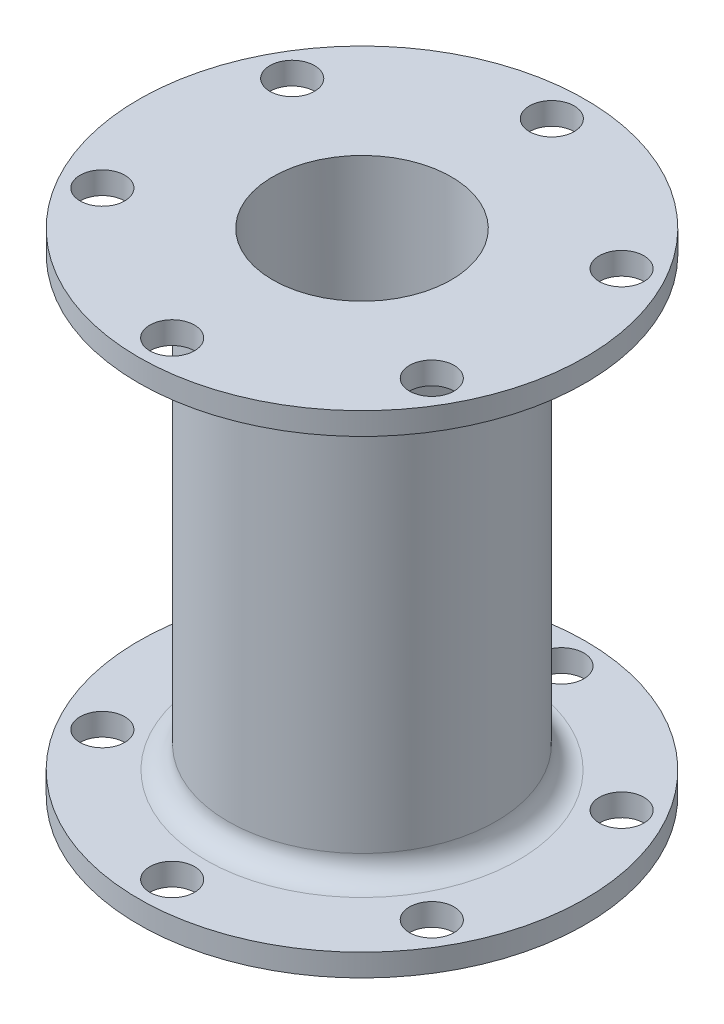
ISO-10303-21;
HEADER;
FILE_DESCRIPTION(('STEP AP214'),'2;1');
FILE_NAME('part.step','',(''),(''),'','','');
FILE_SCHEMA(('AUTOMOTIVE_DESIGN { 1 0 10303 214 1 1 1 1 }'));
ENDSEC;
DATA;
#1=APPLICATION_CONTEXT('core data for automotive mechanical design processes');
#2=APPLICATION_PROTOCOL_DEFINITION('international standard','automotive_design',2000,#1);
#3=PRODUCT_CONTEXT('',#1,'mechanical');
#4=PRODUCT('Part','Part','',(#3));
#5=PRODUCT_RELATED_PRODUCT_CATEGORY('part','',(#4));
#6=PRODUCT_DEFINITION_FORMATION('','',#4);
#7=PRODUCT_DEFINITION_CONTEXT('part definition',#1,'design');
#8=PRODUCT_DEFINITION('design','',#6,#7);
#9=PRODUCT_DEFINITION_SHAPE('','',#8);
#10=(LENGTH_UNIT() NAMED_UNIT(*) SI_UNIT(.MILLI.,.METRE.));
#11=(NAMED_UNIT(*) PLANE_ANGLE_UNIT() SI_UNIT($,.RADIAN.));
#12=(NAMED_UNIT(*) SI_UNIT($,.STERADIAN.) SOLID_ANGLE_UNIT());
#13=UNCERTAINTY_MEASURE_WITH_UNIT(LENGTH_MEASURE(1.E-05),#10,'distance_accuracy_value','');
#14=(GEOMETRIC_REPRESENTATION_CONTEXT(3) GLOBAL_UNCERTAINTY_ASSIGNED_CONTEXT((#13)) GLOBAL_UNIT_ASSIGNED_CONTEXT((#10,
#11,#12)) REPRESENTATION_CONTEXT('',''));
#15=CARTESIAN_POINT('',(0.,0.,0.));
#16=DIRECTION('',(0.,0.,1.));
#17=DIRECTION('',(1.,0.,0.));
#18=AXIS2_PLACEMENT_3D('',#15,#16,#17);
#19=CARTESIAN_POINT('',(0.,12.7,0.));
#20=DIRECTION('',(0.,-1.,0.));
#21=DIRECTION('',(0.,0.,-1.));
#22=AXIS2_PLACEMENT_3D('',#19,#20,#21);
#23=CYLINDRICAL_SURFACE('',#22,127.);
#24=CARTESIAN_POINT('',(0.,12.7,0.));
#25=DIRECTION('',(0.,1.,0.));
#26=DIRECTION('',(0.,0.,1.));
#27=AXIS2_PLACEMENT_3D('',#24,#25,#26);
#28=CIRCLE('',#27,127.);
#29=CARTESIAN_POINT('',(0.,12.7,127.));
#30=VERTEX_POINT('',#29);
#31=EDGE_CURVE('E51',#30,#30,#28,.T.);
#32=ORIENTED_EDGE('',*,*,#31,.F.);
#33=EDGE_LOOP('',(#32));
#34=FACE_BOUND('',#33,.T.);
#35=CARTESIAN_POINT('',(0.,0.,0.));
#36=DIRECTION('',(0.,1.,0.));
#37=DIRECTION('',(0.,0.,1.));
#38=AXIS2_PLACEMENT_3D('',#35,#36,#37);
#39=CIRCLE('',#38,127.);
#40=CARTESIAN_POINT('',(0.,0.,127.));
#41=VERTEX_POINT('',#40);
#42=EDGE_CURVE('E52',#41,#41,#39,.T.);
#43=ORIENTED_EDGE('',*,*,#42,.T.);
#44=EDGE_LOOP('',(#43));
#45=FACE_BOUND('',#44,.T.);
#46=ADVANCED_FACE('F31',(#34,#45),#23,.T.);
#47=CARTESIAN_POINT('',(0.,12.7,0.));
#48=DIRECTION('',(0.,1.,0.));
#49=DIRECTION('',(0.,0.,1.));
#50=AXIS2_PLACEMENT_3D('',#47,#48,#49);
#51=PLANE('',#50);
#52=CARTESIAN_POINT('',(0.,12.7,0.));
#53=DIRECTION('',(0.,1.,0.));
#54=DIRECTION('',(0.,0.,1.));
#55=AXIS2_PLACEMENT_3D('',#52,#53,#54);
#56=CIRCLE('',#55,50.8);
#57=CARTESIAN_POINT('',(0.,12.7,50.8));
#58=VERTEX_POINT('',#57);
#59=EDGE_CURVE('E135',#58,#58,#56,.T.);
#60=ORIENTED_EDGE('',*,*,#59,.F.);
#61=EDGE_LOOP('',(#60));
#62=FACE_BOUND('',#61,.T.);
#63=CARTESIAN_POINT('',(0.,12.7,-107.95));
#64=DIRECTION('',(0.,1.,0.));
#65=DIRECTION('',(0.,0.,1.));
#66=AXIS2_PLACEMENT_3D('',#63,#64,#65);
#67=CIRCLE('',#66,12.7);
#68=CARTESIAN_POINT('',(0.,12.7,-95.25));
#69=VERTEX_POINT('',#68);
#70=EDGE_CURVE('E71',#69,#69,#67,.T.);
#71=ORIENTED_EDGE('',*,*,#70,.F.);
#72=EDGE_LOOP('',(#71));
#73=FACE_BOUND('',#72,.T.);
#74=CARTESIAN_POINT('',(93.6625,12.7,53.975));
#75=DIRECTION('',(0.,1.,0.));
#76=DIRECTION('',(0.,0.,1.));
#77=AXIS2_PLACEMENT_3D('',#74,#75,#76);
#78=CIRCLE('',#77,12.7);
#79=CARTESIAN_POINT('',(93.6625,12.7,66.675));
#80=VERTEX_POINT('',#79);
#81=EDGE_CURVE('E84',#80,#80,#78,.T.);
#82=ORIENTED_EDGE('',*,*,#81,.F.);
#83=EDGE_LOOP('',(#82));
#84=FACE_BOUND('',#83,.T.);
#85=CARTESIAN_POINT('',(0.,12.7,107.95));
#86=DIRECTION('',(0.,1.,0.));
#87=DIRECTION('',(0.,0.,1.));
#88=AXIS2_PLACEMENT_3D('',#85,#86,#87);
#89=CIRCLE('',#88,12.7);
#90=CARTESIAN_POINT('',(0.,12.7,120.65));
#91=VERTEX_POINT('',#90);
#92=EDGE_CURVE('E65',#91,#91,#89,.T.);
#93=ORIENTED_EDGE('',*,*,#92,.F.);
#94=EDGE_LOOP('',(#93));
#95=FACE_BOUND('',#94,.T.);
#96=CARTESIAN_POINT('',(-93.6625,12.7,-53.975));
#97=DIRECTION('',(0.,1.,0.));
#98=DIRECTION('',(0.,0.,1.));
#99=AXIS2_PLACEMENT_3D('',#96,#97,#98);
#100=CIRCLE('',#99,12.7);
#101=CARTESIAN_POINT('',(-93.6625,12.7,-41.275));
#102=VERTEX_POINT('',#101);
#103=EDGE_CURVE('E58',#102,#102,#100,.T.);
#104=ORIENTED_EDGE('',*,*,#103,.F.);
#105=EDGE_LOOP('',(#104));
#106=FACE_BOUND('',#105,.T.);
#107=CARTESIAN_POINT('',(93.6625,12.7,-53.975));
#108=DIRECTION('',(0.,1.,0.));
#109=DIRECTION('',(0.,0.,1.));
#110=AXIS2_PLACEMENT_3D('',#107,#108,#109);
#111=CIRCLE('',#110,12.7);
#112=CARTESIAN_POINT('',(93.6625,12.7,-41.275));
#113=VERTEX_POINT('',#112);
#114=EDGE_CURVE('E79',#113,#113,#111,.T.);
#115=ORIENTED_EDGE('',*,*,#114,.F.);
#116=EDGE_LOOP('',(#115));
#117=FACE_BOUND('',#116,.T.);
#118=CARTESIAN_POINT('',(-93.6625,12.7,53.975));
#119=DIRECTION('',(0.,1.,0.));
#120=DIRECTION('',(0.,0.,1.));
#121=AXIS2_PLACEMENT_3D('',#118,#119,#120);
#122=CIRCLE('',#121,12.7);
#123=CARTESIAN_POINT('',(-93.6625,12.7,66.675));
#124=VERTEX_POINT('',#123);
#125=EDGE_CURVE('E72',#124,#124,#122,.T.);
#126=ORIENTED_EDGE('',*,*,#125,.F.);
#127=EDGE_LOOP('',(#126));
#128=FACE_BOUND('',#127,.T.);
#129=ORIENTED_EDGE('',*,*,#31,.T.);
#130=EDGE_LOOP('',(#129));
#131=FACE_BOUND('',#130,.T.);
#132=ADVANCED_FACE('F182',(#62,#73,#84,#95,#106,#117,#128,#131),#51,.T.);
#133=CARTESIAN_POINT('',(0.,0.,0.));
#134=DIRECTION('',(0.,1.,0.));
#135=DIRECTION('',(0.,0.,1.));
#136=AXIS2_PLACEMENT_3D('',#133,#134,#135);
#137=PLANE('',#136);
#138=CARTESIAN_POINT('',(0.,0.,0.));
#139=DIRECTION('',(0.,1.,0.));
#140=DIRECTION('',(0.,0.,1.));
#141=AXIS2_PLACEMENT_3D('',#138,#139,#140);
#142=CIRCLE('',#141,88.9);
#143=CARTESIAN_POINT('',(0.,0.,88.9));
#144=VERTEX_POINT('',#143);
#145=EDGE_CURVE('E10',#144,#144,#142,.T.);
#146=ORIENTED_EDGE('',*,*,#145,.T.);
#147=EDGE_LOOP('',(#146));
#148=FACE_BOUND('',#147,.T.);
#149=CARTESIAN_POINT('',(0.,0.,-107.95));
#150=DIRECTION('',(0.,1.,0.));
#151=DIRECTION('',(0.,0.,1.));
#152=AXIS2_PLACEMENT_3D('',#149,#150,#151);
#153=CIRCLE('',#152,12.7);
#154=CARTESIAN_POINT('',(0.,0.,-95.25));
#155=VERTEX_POINT('',#154);
#156=EDGE_CURVE('E55',#155,#155,#153,.T.);
#157=ORIENTED_EDGE('',*,*,#156,.T.);
#158=EDGE_LOOP('',(#157));
#159=FACE_BOUND('',#158,.T.);
#160=CARTESIAN_POINT('',(93.6625,0.,53.975));
#161=DIRECTION('',(0.,1.,0.));
#162=DIRECTION('',(0.,0.,1.));
#163=AXIS2_PLACEMENT_3D('',#160,#161,#162);
#164=CIRCLE('',#163,12.7);
#165=CARTESIAN_POINT('',(93.6625,0.,66.675));
#166=VERTEX_POINT('',#165);
#167=EDGE_CURVE('E76',#166,#166,#164,.T.);
#168=ORIENTED_EDGE('',*,*,#167,.T.);
#169=EDGE_LOOP('',(#168));
#170=FACE_BOUND('',#169,.T.);
#171=CARTESIAN_POINT('',(0.,0.,107.95));
#172=DIRECTION('',(0.,1.,0.));
#173=DIRECTION('',(0.,0.,1.));
#174=AXIS2_PLACEMENT_3D('',#171,#172,#173);
#175=CIRCLE('',#174,12.7);
#176=CARTESIAN_POINT('',(0.,0.,120.65));
#177=VERTEX_POINT('',#176);
#178=EDGE_CURVE('E68',#177,#177,#175,.T.);
#179=ORIENTED_EDGE('',*,*,#178,.T.);
#180=EDGE_LOOP('',(#179));
#181=FACE_BOUND('',#180,.T.);
#182=CARTESIAN_POINT('',(-93.6625,0.,-53.975));
#183=DIRECTION('',(0.,1.,0.));
#184=DIRECTION('',(0.,0.,1.));
#185=AXIS2_PLACEMENT_3D('',#182,#183,#184);
#186=CIRCLE('',#185,12.7);
#187=CARTESIAN_POINT('',(-93.6625,0.,-41.275));
#188=VERTEX_POINT('',#187);
#189=EDGE_CURVE('E61',#188,#188,#186,.T.);
#190=ORIENTED_EDGE('',*,*,#189,.T.);
#191=EDGE_LOOP('',(#190));
#192=FACE_BOUND('',#191,.T.);
#193=CARTESIAN_POINT('',(93.6625,0.,-53.975));
#194=DIRECTION('',(0.,1.,0.));
#195=DIRECTION('',(0.,0.,1.));
#196=AXIS2_PLACEMENT_3D('',#193,#194,#195);
#197=CIRCLE('',#196,12.7);
#198=CARTESIAN_POINT('',(93.6625,0.,-41.275));
#199=VERTEX_POINT('',#198);
#200=EDGE_CURVE('E62',#199,#199,#197,.T.);
#201=ORIENTED_EDGE('',*,*,#200,.T.);
#202=EDGE_LOOP('',(#201));
#203=FACE_BOUND('',#202,.T.);
#204=CARTESIAN_POINT('',(-93.6625,0.,53.975));
#205=DIRECTION('',(0.,1.,0.));
#206=DIRECTION('',(0.,0.,1.));
#207=AXIS2_PLACEMENT_3D('',#204,#205,#206);
#208=CIRCLE('',#207,12.7);
#209=CARTESIAN_POINT('',(-93.6625,0.,66.675));
#210=VERTEX_POINT('',#209);
#211=EDGE_CURVE('E75',#210,#210,#208,.T.);
#212=ORIENTED_EDGE('',*,*,#211,.T.);
#213=EDGE_LOOP('',(#212));
#214=FACE_BOUND('',#213,.T.);
#215=ORIENTED_EDGE('',*,*,#42,.F.);
#216=EDGE_LOOP('',(#215));
#217=FACE_BOUND('',#216,.T.);
#218=ADVANCED_FACE('F188',(#148,#159,#170,#181,#192,#203,#214,#217),#137,.F.);
#219=CARTESIAN_POINT('',(-93.6625,0.,53.975));
#220=DIRECTION('',(0.,1.,0.));
#221=DIRECTION('',(0.,0.,1.));
#222=AXIS2_PLACEMENT_3D('',#219,#220,#221);
#223=CYLINDRICAL_SURFACE('',#222,12.7);
#224=ORIENTED_EDGE('',*,*,#211,.F.);
#225=EDGE_LOOP('',(#224));
#226=FACE_BOUND('',#225,.T.);
#227=ORIENTED_EDGE('',*,*,#125,.T.);
#228=EDGE_LOOP('',(#227));
#229=FACE_BOUND('',#228,.T.);
#230=ADVANCED_FACE('F231',(#226,#229),#223,.F.);
#231=CARTESIAN_POINT('',(93.6625,0.,-53.975));
#232=DIRECTION('',(0.,1.,0.));
#233=DIRECTION('',(0.,0.,1.));
#234=AXIS2_PLACEMENT_3D('',#231,#232,#233);
#235=CYLINDRICAL_SURFACE('',#234,12.7);
#236=ORIENTED_EDGE('',*,*,#200,.F.);
#237=EDGE_LOOP('',(#236));
#238=FACE_BOUND('',#237,.T.);
#239=ORIENTED_EDGE('',*,*,#114,.T.);
#240=EDGE_LOOP('',(#239));
#241=FACE_BOUND('',#240,.T.);
#242=ADVANCED_FACE('F227',(#238,#241),#235,.F.);
#243=CARTESIAN_POINT('',(-93.6625,0.,-53.975));
#244=DIRECTION('',(0.,1.,0.));
#245=DIRECTION('',(0.,0.,1.));
#246=AXIS2_PLACEMENT_3D('',#243,#244,#245);
#247=CYLINDRICAL_SURFACE('',#246,12.7);
#248=ORIENTED_EDGE('',*,*,#189,.F.);
#249=EDGE_LOOP('',(#248));
#250=FACE_BOUND('',#249,.T.);
#251=ORIENTED_EDGE('',*,*,#103,.T.);
#252=EDGE_LOOP('',(#251));
#253=FACE_BOUND('',#252,.T.);
#254=ADVANCED_FACE('F230',(#250,#253),#247,.F.);
#255=CARTESIAN_POINT('',(0.,0.,107.95));
#256=DIRECTION('',(0.,1.,0.));
#257=DIRECTION('',(0.,0.,1.));
#258=AXIS2_PLACEMENT_3D('',#255,#256,#257);
#259=CYLINDRICAL_SURFACE('',#258,12.7);
#260=ORIENTED_EDGE('',*,*,#178,.F.);
#261=EDGE_LOOP('',(#260));
#262=FACE_BOUND('',#261,.T.);
#263=ORIENTED_EDGE('',*,*,#92,.T.);
#264=EDGE_LOOP('',(#263));
#265=FACE_BOUND('',#264,.T.);
#266=ADVANCED_FACE('F225',(#262,#265),#259,.F.);
#267=CARTESIAN_POINT('',(93.6625,0.,53.975));
#268=DIRECTION('',(0.,1.,0.));
#269=DIRECTION('',(0.,0.,1.));
#270=AXIS2_PLACEMENT_3D('',#267,#268,#269);
#271=CYLINDRICAL_SURFACE('',#270,12.7);
#272=ORIENTED_EDGE('',*,*,#167,.F.);
#273=EDGE_LOOP('',(#272));
#274=FACE_BOUND('',#273,.T.);
#275=ORIENTED_EDGE('',*,*,#81,.T.);
#276=EDGE_LOOP('',(#275));
#277=FACE_BOUND('',#276,.T.);
#278=ADVANCED_FACE('F219',(#274,#277),#271,.F.);
#279=CARTESIAN_POINT('',(0.,0.,-107.95));
#280=DIRECTION('',(0.,1.,0.));
#281=DIRECTION('',(0.,0.,1.));
#282=AXIS2_PLACEMENT_3D('',#279,#280,#281);
#283=CYLINDRICAL_SURFACE('',#282,12.7);
#284=ORIENTED_EDGE('',*,*,#156,.F.);
#285=EDGE_LOOP('',(#284));
#286=FACE_BOUND('',#285,.T.);
#287=ORIENTED_EDGE('',*,*,#70,.T.);
#288=EDGE_LOOP('',(#287));
#289=FACE_BOUND('',#288,.T.);
#290=ADVANCED_FACE('F212',(#286,#289),#283,.F.);
#291=CARTESIAN_POINT('',(0.,-254.,0.));
#292=DIRECTION('',(0.,1.,0.));
#293=DIRECTION('',(0.,0.,1.));
#294=AXIS2_PLACEMENT_3D('',#291,#292,#293);
#295=CYLINDRICAL_SURFACE('',#294,76.2);
#296=CARTESIAN_POINT('',(0.,-241.3,0.));
#297=DIRECTION('',(0.,-1.,0.));
#298=DIRECTION('',(0.,0.,-1.));
#299=AXIS2_PLACEMENT_3D('',#296,#297,#298);
#300=CIRCLE('',#299,76.2);
#301=CARTESIAN_POINT('',(0.,-241.3,-76.2));
#302=VERTEX_POINT('',#301);
#303=EDGE_CURVE('E39',#302,#302,#300,.F.);
#304=ORIENTED_EDGE('',*,*,#303,.T.);
#305=EDGE_LOOP('',(#304));
#306=FACE_BOUND('',#305,.T.);
#307=CARTESIAN_POINT('',(0.,-12.7,0.));
#308=DIRECTION('',(0.,1.,0.));
#309=DIRECTION('',(0.,0.,1.));
#310=AXIS2_PLACEMENT_3D('',#307,#308,#309);
#311=CIRCLE('',#310,76.2);
#312=CARTESIAN_POINT('',(0.,-12.7,76.2));
#313=VERTEX_POINT('',#312);
#314=EDGE_CURVE('E43',#313,#313,#311,.F.);
#315=ORIENTED_EDGE('',*,*,#314,.T.);
#316=EDGE_LOOP('',(#315));
#317=FACE_BOUND('',#316,.T.);
#318=ADVANCED_FACE('F166',(#306,#317),#295,.T.);
#319=CARTESIAN_POINT('',(0.,-266.7,0.));
#320=DIRECTION('',(0.,1.,0.));
#321=DIRECTION('',(0.,0.,1.));
#322=AXIS2_PLACEMENT_3D('',#319,#320,#321);
#323=CYLINDRICAL_SURFACE('',#322,127.);
#324=CARTESIAN_POINT('',(0.,-266.7,0.));
#325=DIRECTION('',(0.,-1.,0.));
#326=DIRECTION('',(0.,0.,-1.));
#327=AXIS2_PLACEMENT_3D('',#324,#325,#326);
#328=CIRCLE('',#327,127.);
#329=CARTESIAN_POINT('',(0.,-266.7,-127.));
#330=VERTEX_POINT('',#329);
#331=EDGE_CURVE('E87',#330,#330,#328,.T.);
#332=ORIENTED_EDGE('',*,*,#331,.F.);
#333=EDGE_LOOP('',(#332));
#334=FACE_BOUND('',#333,.T.);
#335=CARTESIAN_POINT('',(0.,-254.,0.));
#336=DIRECTION('',(0.,-1.,0.));
#337=DIRECTION('',(0.,0.,-1.));
#338=AXIS2_PLACEMENT_3D('',#335,#336,#337);
#339=CIRCLE('',#338,127.);
#340=CARTESIAN_POINT('',(0.,-254.,-127.));
#341=VERTEX_POINT('',#340);
#342=EDGE_CURVE('E94',#341,#341,#339,.T.);
#343=ORIENTED_EDGE('',*,*,#342,.T.);
#344=EDGE_LOOP('',(#343));
#345=FACE_BOUND('',#344,.T.);
#346=ADVANCED_FACE('F148',(#334,#345),#323,.T.);
#347=CARTESIAN_POINT('',(0.,-266.7,0.));
#348=DIRECTION('',(0.,-1.,0.));
#349=DIRECTION('',(0.,0.,-1.));
#350=AXIS2_PLACEMENT_3D('',#347,#348,#349);
#351=PLANE('',#350);
#352=CARTESIAN_POINT('',(0.,-266.7,0.));
#353=DIRECTION('',(0.,-1.,0.));
#354=DIRECTION('',(0.,0.,-1.));
#355=AXIS2_PLACEMENT_3D('',#352,#353,#354);
#356=CIRCLE('',#355,50.8);
#357=CARTESIAN_POINT('',(0.,-266.7,-50.8));
#358=VERTEX_POINT('',#357);
#359=EDGE_CURVE('E35',#358,#358,#356,.T.);
#360=ORIENTED_EDGE('',*,*,#359,.F.);
#361=EDGE_LOOP('',(#360));
#362=FACE_BOUND('',#361,.T.);
#363=CARTESIAN_POINT('',(0.,-266.7,107.95));
#364=DIRECTION('',(0.,-1.,0.));
#365=DIRECTION('',(0.,0.,-1.));
#366=AXIS2_PLACEMENT_3D('',#363,#364,#365);
#367=CIRCLE('',#366,12.7);
#368=CARTESIAN_POINT('',(0.,-266.7,95.25));
#369=VERTEX_POINT('',#368);
#370=EDGE_CURVE('E113',#369,#369,#367,.T.);
#371=ORIENTED_EDGE('',*,*,#370,.F.);
#372=EDGE_LOOP('',(#371));
#373=FACE_BOUND('',#372,.T.);
#374=CARTESIAN_POINT('',(93.6625,-266.7,-53.975));
#375=DIRECTION('',(0.,-1.,0.));
#376=DIRECTION('',(0.,0.,-1.));
#377=AXIS2_PLACEMENT_3D('',#374,#375,#376);
#378=CIRCLE('',#377,12.7);
#379=CARTESIAN_POINT('',(93.6625,-266.7,-66.675));
#380=VERTEX_POINT('',#379);
#381=EDGE_CURVE('E126',#380,#380,#378,.T.);
#382=ORIENTED_EDGE('',*,*,#381,.F.);
#383=EDGE_LOOP('',(#382));
#384=FACE_BOUND('',#383,.T.);
#385=CARTESIAN_POINT('',(5.51027490844127,-266.7,-107.95));
#386=DIRECTION('',(0.,-1.,0.));
#387=DIRECTION('',(0.,0.,-1.));
#388=AXIS2_PLACEMENT_3D('',#385,#386,#387);
#389=CIRCLE('',#388,12.7);
#390=CARTESIAN_POINT('',(5.51027490844127,-266.7,-120.65));
#391=VERTEX_POINT('',#390);
#392=EDGE_CURVE('E107',#391,#391,#389,.T.);
#393=ORIENTED_EDGE('',*,*,#392,.F.);
#394=EDGE_LOOP('',(#393));
#395=FACE_BOUND('',#394,.T.);
#396=CARTESIAN_POINT('',(-93.6625,-266.7,53.975));
#397=DIRECTION('',(0.,-1.,0.));
#398=DIRECTION('',(0.,0.,-1.));
#399=AXIS2_PLACEMENT_3D('',#396,#397,#398);
#400=CIRCLE('',#399,12.7);
#401=CARTESIAN_POINT('',(-93.6625,-266.7,41.275));
#402=VERTEX_POINT('',#401);
#403=EDGE_CURVE('E100',#402,#402,#400,.T.);
#404=ORIENTED_EDGE('',*,*,#403,.F.);
#405=EDGE_LOOP('',(#404));
#406=FACE_BOUND('',#405,.T.);
#407=CARTESIAN_POINT('',(93.6625,-266.7,53.975));
#408=DIRECTION('',(0.,-1.,0.));
#409=DIRECTION('',(0.,0.,-1.));
#410=AXIS2_PLACEMENT_3D('',#407,#408,#409);
#411=CIRCLE('',#410,12.7);
#412=CARTESIAN_POINT('',(93.6625,-266.7,41.275));
#413=VERTEX_POINT('',#412);
#414=EDGE_CURVE('E121',#413,#413,#411,.T.);
#415=ORIENTED_EDGE('',*,*,#414,.F.);
#416=EDGE_LOOP('',(#415));
#417=FACE_BOUND('',#416,.T.);
#418=CARTESIAN_POINT('',(-93.6625,-266.7,-53.975));
#419=DIRECTION('',(0.,-1.,0.));
#420=DIRECTION('',(0.,0.,-1.));
#421=AXIS2_PLACEMENT_3D('',#418,#419,#420);
#422=CIRCLE('',#421,12.7);
#423=CARTESIAN_POINT('',(-93.6625,-266.7,-66.675));
#424=VERTEX_POINT('',#423);
#425=EDGE_CURVE('E114',#424,#424,#422,.T.);
#426=ORIENTED_EDGE('',*,*,#425,.F.);
#427=EDGE_LOOP('',(#426));
#428=FACE_BOUND('',#427,.T.);
#429=ORIENTED_EDGE('',*,*,#331,.T.);
#430=EDGE_LOOP('',(#429));
#431=FACE_BOUND('',#430,.T.);
#432=ADVANCED_FACE('F144',(#362,#373,#384,#395,#406,#417,#428,#431),#351,.T.);
#433=CARTESIAN_POINT('',(0.,-254.,0.));
#434=DIRECTION('',(0.,-1.,0.));
#435=DIRECTION('',(0.,0.,-1.));
#436=AXIS2_PLACEMENT_3D('',#433,#434,#435);
#437=PLANE('',#436);
#438=CARTESIAN_POINT('',(0.,-254.,0.));
#439=DIRECTION('',(0.,-1.,0.));
#440=DIRECTION('',(0.,0.,-1.));
#441=AXIS2_PLACEMENT_3D('',#438,#439,#440);
#442=CIRCLE('',#441,88.9);
#443=CARTESIAN_POINT('',(0.,-254.,-88.9));
#444=VERTEX_POINT('',#443);
#445=EDGE_CURVE('E48',#444,#444,#442,.T.);
#446=ORIENTED_EDGE('',*,*,#445,.T.);
#447=EDGE_LOOP('',(#446));
#448=FACE_BOUND('',#447,.T.);
#449=CARTESIAN_POINT('',(0.,-254.,107.95));
#450=DIRECTION('',(0.,-1.,0.));
#451=DIRECTION('',(0.,0.,-1.));
#452=AXIS2_PLACEMENT_3D('',#449,#450,#451);
#453=CIRCLE('',#452,12.7);
#454=CARTESIAN_POINT('',(0.,-254.,95.25));
#455=VERTEX_POINT('',#454);
#456=EDGE_CURVE('E97',#455,#455,#453,.T.);
#457=ORIENTED_EDGE('',*,*,#456,.T.);
#458=EDGE_LOOP('',(#457));
#459=FACE_BOUND('',#458,.T.);
#460=CARTESIAN_POINT('',(93.6625,-254.,-53.975));
#461=DIRECTION('',(0.,-1.,0.));
#462=DIRECTION('',(0.,0.,-1.));
#463=AXIS2_PLACEMENT_3D('',#460,#461,#462);
#464=CIRCLE('',#463,12.7);
#465=CARTESIAN_POINT('',(93.6625,-254.,-66.675));
#466=VERTEX_POINT('',#465);
#467=EDGE_CURVE('E118',#466,#466,#464,.T.);
#468=ORIENTED_EDGE('',*,*,#467,.T.);
#469=EDGE_LOOP('',(#468));
#470=FACE_BOUND('',#469,.T.);
#471=CARTESIAN_POINT('',(5.51027490844127,-254.,-107.95));
#472=DIRECTION('',(0.,-1.,0.));
#473=DIRECTION('',(0.,0.,-1.));
#474=AXIS2_PLACEMENT_3D('',#471,#472,#473);
#475=CIRCLE('',#474,12.7);
#476=CARTESIAN_POINT('',(5.51027490844127,-254.,-120.65));
#477=VERTEX_POINT('',#476);
#478=EDGE_CURVE('E110',#477,#477,#475,.T.);
#479=ORIENTED_EDGE('',*,*,#478,.T.);
#480=EDGE_LOOP('',(#479));
#481=FACE_BOUND('',#480,.T.);
#482=CARTESIAN_POINT('',(-93.6625,-254.,53.975));
#483=DIRECTION('',(0.,-1.,0.));
#484=DIRECTION('',(0.,0.,-1.));
#485=AXIS2_PLACEMENT_3D('',#482,#483,#484);
#486=CIRCLE('',#485,12.7);
#487=CARTESIAN_POINT('',(-93.6625,-254.,41.275));
#488=VERTEX_POINT('',#487);
#489=EDGE_CURVE('E103',#488,#488,#486,.T.);
#490=ORIENTED_EDGE('',*,*,#489,.T.);
#491=EDGE_LOOP('',(#490));
#492=FACE_BOUND('',#491,.T.);
#493=CARTESIAN_POINT('',(93.6625,-254.,53.975));
#494=DIRECTION('',(0.,-1.,0.));
#495=DIRECTION('',(0.,0.,-1.));
#496=AXIS2_PLACEMENT_3D('',#493,#494,#495);
#497=CIRCLE('',#496,12.7);
#498=CARTESIAN_POINT('',(93.6625,-254.,41.275));
#499=VERTEX_POINT('',#498);
#500=EDGE_CURVE('E104',#499,#499,#497,.T.);
#501=ORIENTED_EDGE('',*,*,#500,.T.);
#502=EDGE_LOOP('',(#501));
#503=FACE_BOUND('',#502,.T.);
#504=CARTESIAN_POINT('',(-93.6625,-254.,-53.975));
#505=DIRECTION('',(0.,-1.,0.));
#506=DIRECTION('',(0.,0.,-1.));
#507=AXIS2_PLACEMENT_3D('',#504,#505,#506);
#508=CIRCLE('',#507,12.7);
#509=CARTESIAN_POINT('',(-93.6625,-254.,-66.675));
#510=VERTEX_POINT('',#509);
#511=EDGE_CURVE('E117',#510,#510,#508,.T.);
#512=ORIENTED_EDGE('',*,*,#511,.T.);
#513=EDGE_LOOP('',(#512));
#514=FACE_BOUND('',#513,.T.);
#515=ORIENTED_EDGE('',*,*,#342,.F.);
#516=EDGE_LOOP('',(#515));
#517=FACE_BOUND('',#516,.T.);
#518=ADVANCED_FACE('F147',(#448,#459,#470,#481,#492,#503,#514,#517),#437,.F.);
#519=CARTESIAN_POINT('',(-93.6625,-254.,-53.975));
#520=DIRECTION('',(0.,-1.,0.));
#521=DIRECTION('',(0.,0.,-1.));
#522=AXIS2_PLACEMENT_3D('',#519,#520,#521);
#523=CYLINDRICAL_SURFACE('',#522,12.7);
#524=ORIENTED_EDGE('',*,*,#511,.F.);
#525=EDGE_LOOP('',(#524));
#526=FACE_BOUND('',#525,.T.);
#527=ORIENTED_EDGE('',*,*,#425,.T.);
#528=EDGE_LOOP('',(#527));
#529=FACE_BOUND('',#528,.T.);
#530=ADVANCED_FACE('F171',(#526,#529),#523,.F.);
#531=CARTESIAN_POINT('',(93.6625,-254.,53.975));
#532=DIRECTION('',(0.,-1.,0.));
#533=DIRECTION('',(0.,0.,-1.));
#534=AXIS2_PLACEMENT_3D('',#531,#532,#533);
#535=CYLINDRICAL_SURFACE('',#534,12.7);
#536=ORIENTED_EDGE('',*,*,#500,.F.);
#537=EDGE_LOOP('',(#536));
#538=FACE_BOUND('',#537,.T.);
#539=ORIENTED_EDGE('',*,*,#414,.T.);
#540=EDGE_LOOP('',(#539));
#541=FACE_BOUND('',#540,.T.);
#542=ADVANCED_FACE('F177',(#538,#541),#535,.F.);
#543=CARTESIAN_POINT('',(-93.6625,-254.,53.975));
#544=DIRECTION('',(0.,-1.,0.));
#545=DIRECTION('',(0.,0.,-1.));
#546=AXIS2_PLACEMENT_3D('',#543,#544,#545);
#547=CYLINDRICAL_SURFACE('',#546,12.7);
#548=ORIENTED_EDGE('',*,*,#489,.F.);
#549=EDGE_LOOP('',(#548));
#550=FACE_BOUND('',#549,.T.);
#551=ORIENTED_EDGE('',*,*,#403,.T.);
#552=EDGE_LOOP('',(#551));
#553=FACE_BOUND('',#552,.T.);
#554=ADVANCED_FACE('F336',(#550,#553),#547,.F.);
#555=CARTESIAN_POINT('',(5.51027490844127,-254.,-107.95));
#556=DIRECTION('',(0.,-1.,0.));
#557=DIRECTION('',(0.,0.,-1.));
#558=AXIS2_PLACEMENT_3D('',#555,#556,#557);
#559=CYLINDRICAL_SURFACE('',#558,12.7);
#560=ORIENTED_EDGE('',*,*,#478,.F.);
#561=EDGE_LOOP('',(#560));
#562=FACE_BOUND('',#561,.T.);
#563=ORIENTED_EDGE('',*,*,#392,.T.);
#564=EDGE_LOOP('',(#563));
#565=FACE_BOUND('',#564,.T.);
#566=ADVANCED_FACE('F346',(#562,#565),#559,.F.);
#567=CARTESIAN_POINT('',(93.6625,-254.,-53.975));
#568=DIRECTION('',(0.,-1.,0.));
#569=DIRECTION('',(0.,0.,-1.));
#570=AXIS2_PLACEMENT_3D('',#567,#568,#569);
#571=CYLINDRICAL_SURFACE('',#570,12.7);
#572=ORIENTED_EDGE('',*,*,#467,.F.);
#573=EDGE_LOOP('',(#572));
#574=FACE_BOUND('',#573,.T.);
#575=ORIENTED_EDGE('',*,*,#381,.T.);
#576=EDGE_LOOP('',(#575));
#577=FACE_BOUND('',#576,.T.);
#578=ADVANCED_FACE('F203',(#574,#577),#571,.F.);
#579=CARTESIAN_POINT('',(0.,-254.,107.95));
#580=DIRECTION('',(0.,-1.,0.));
#581=DIRECTION('',(0.,0.,-1.));
#582=AXIS2_PLACEMENT_3D('',#579,#580,#581);
#583=CYLINDRICAL_SURFACE('',#582,12.7);
#584=ORIENTED_EDGE('',*,*,#456,.F.);
#585=EDGE_LOOP('',(#584));
#586=FACE_BOUND('',#585,.T.);
#587=ORIENTED_EDGE('',*,*,#370,.T.);
#588=EDGE_LOOP('',(#587));
#589=FACE_BOUND('',#588,.T.);
#590=ADVANCED_FACE('F196',(#586,#589),#583,.F.);
#591=CARTESIAN_POINT('',(0.,-241.3,0.));
#592=DIRECTION('',(0.,-1.,0.));
#593=DIRECTION('',(0.,0.,-1.));
#594=AXIS2_PLACEMENT_3D('',#591,#592,#593);
#595=TOROIDAL_SURFACE('',#594,88.9,12.7);
#596=ORIENTED_EDGE('',*,*,#303,.F.);
#597=EDGE_LOOP('',(#596));
#598=FACE_BOUND('',#597,.T.);
#599=ORIENTED_EDGE('',*,*,#445,.F.);
#600=EDGE_LOOP('',(#599));
#601=FACE_BOUND('',#600,.T.);
#602=ADVANCED_FACE('F194',(#598,#601),#595,.F.);
#603=CARTESIAN_POINT('',(0.,-12.7,0.));
#604=DIRECTION('',(0.,1.,0.));
#605=DIRECTION('',(0.,0.,1.));
#606=AXIS2_PLACEMENT_3D('',#603,#604,#605);
#607=TOROIDAL_SURFACE('',#606,88.9,12.7);
#608=ORIENTED_EDGE('',*,*,#145,.F.);
#609=EDGE_LOOP('',(#608));
#610=FACE_BOUND('',#609,.T.);
#611=ORIENTED_EDGE('',*,*,#314,.F.);
#612=EDGE_LOOP('',(#611));
#613=FACE_BOUND('',#612,.T.);
#614=ADVANCED_FACE('F33',(#610,#613),#607,.F.);
#615=CARTESIAN_POINT('',(0.,-312.42,0.));
#616=DIRECTION('',(0.,1.,0.));
#617=DIRECTION('',(0.,0.,1.));
#618=AXIS2_PLACEMENT_3D('',#615,#616,#617);
#619=CYLINDRICAL_SURFACE('',#618,50.8);
#620=ORIENTED_EDGE('',*,*,#359,.T.);
#621=EDGE_LOOP('',(#620));
#622=FACE_BOUND('',#621,.T.);
#623=ORIENTED_EDGE('',*,*,#59,.T.);
#624=EDGE_LOOP('',(#623));
#625=FACE_BOUND('',#624,.T.);
#626=ADVANCED_FACE('F142',(#622,#625),#619,.F.);
#627=CLOSED_SHELL('',(#46,#132,#218,#230,#242,#254,#266,#278,#290,#318,#346,#432,#518,#530,#542,
#554,#566,#578,#590,#602,#614,#626));
#628=MANIFOLD_SOLID_BREP('B2',#627);
#629=ADVANCED_BREP_SHAPE_REPRESENTATION('',(#18,#628),#14);
#630=SHAPE_DEFINITION_REPRESENTATION(#9,#629);
ENDSEC;
END-ISO-10303-21;
